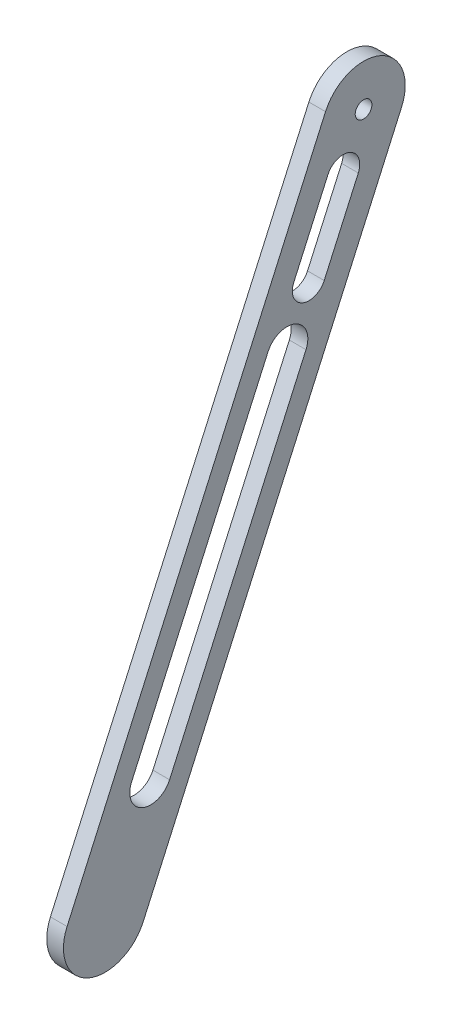
ISO-10303-21;
HEADER;
FILE_DESCRIPTION(('STEP AP214'),'2;1');
FILE_NAME('part.step','',(''),(''),'','','');
FILE_SCHEMA(('AUTOMOTIVE_DESIGN { 1 0 10303 214 1 1 1 1 }'));
ENDSEC;
DATA;
#1=APPLICATION_CONTEXT('core data for automotive mechanical design processes');
#2=APPLICATION_PROTOCOL_DEFINITION('international standard','automotive_design',2000,#1);
#3=PRODUCT_CONTEXT('',#1,'mechanical');
#4=PRODUCT('Part','Part','',(#3));
#5=PRODUCT_RELATED_PRODUCT_CATEGORY('part','',(#4));
#6=PRODUCT_DEFINITION_FORMATION('','',#4);
#7=PRODUCT_DEFINITION_CONTEXT('part definition',#1,'design');
#8=PRODUCT_DEFINITION('design','',#6,#7);
#9=PRODUCT_DEFINITION_SHAPE('','',#8);
#10=(LENGTH_UNIT() NAMED_UNIT(*) SI_UNIT(.MILLI.,.METRE.));
#11=(NAMED_UNIT(*) PLANE_ANGLE_UNIT() SI_UNIT($,.RADIAN.));
#12=(NAMED_UNIT(*) SI_UNIT($,.STERADIAN.) SOLID_ANGLE_UNIT());
#13=UNCERTAINTY_MEASURE_WITH_UNIT(LENGTH_MEASURE(1.E-05),#10,'distance_accuracy_value','');
#14=(GEOMETRIC_REPRESENTATION_CONTEXT(3) GLOBAL_UNCERTAINTY_ASSIGNED_CONTEXT((#13)) GLOBAL_UNIT_ASSIGNED_CONTEXT((#10,
#11,#12)) REPRESENTATION_CONTEXT('',''));
#15=CARTESIAN_POINT('',(0.,0.,0.));
#16=DIRECTION('',(0.,0.,1.));
#17=DIRECTION('',(1.,0.,0.));
#18=AXIS2_PLACEMENT_3D('',#15,#16,#17);
#19=CARTESIAN_POINT('',(3.,15.4,140.123817953225));
#20=DIRECTION('',(1.,0.,0.));
#21=DIRECTION('',(0.,0.,-1.));
#22=AXIS2_PLACEMENT_3D('',#19,#20,#21);
#23=PLANE('',#22);
#24=DIRECTION('',(0.,0.912482298428306,-0.409116187720549));
#25=VECTOR('',#24,1.);
#26=CARTESIAN_POINT('',(3.,86.8643981703128,103.972714316475));
#27=LINE('',#26,#25);
#28=CARTESIAN_POINT('',(3.,32.1154602646141,128.519685579708));
#29=VERTEX_POINT('',#28);
#30=CARTESIAN_POINT('',(3.,86.8643981703128,103.972714316475));
#31=VERTEX_POINT('',#30);
#32=EDGE_CURVE('E166',#29,#31,#27,.T.);
#33=ORIENTED_EDGE('',*,*,#32,.F.);
#34=CARTESIAN_POINT('',(3.,33.6496459685661,131.941494198814));
#35=DIRECTION('',(1.,0.,0.));
#36=DIRECTION('',(0.,0.,-1.));
#37=AXIS2_PLACEMENT_3D('',#34,#35,#36);
#38=CIRCLE('',#37,3.75000000000001);
#39=CARTESIAN_POINT('',(3.,35.1838316725182,135.36330281792));
#40=VERTEX_POINT('',#39);
#41=EDGE_CURVE('E164',#40,#29,#38,.T.);
#42=ORIENTED_EDGE('',*,*,#41,.F.);
#43=DIRECTION('',(0.,-0.912482298428307,0.409116187720549));
#44=VECTOR('',#43,1.);
#45=CARTESIAN_POINT('',(3.,89.9327695782166,110.816331554687));
#46=LINE('',#45,#44);
#47=CARTESIAN_POINT('',(3.,89.9327695782166,110.816331554687));
#48=VERTEX_POINT('',#47);
#49=EDGE_CURVE('E172',#48,#40,#46,.T.);
#50=ORIENTED_EDGE('',*,*,#49,.F.);
#51=CARTESIAN_POINT('',(3.,88.3985838742648,107.394522935581));
#52=DIRECTION('',(1.,0.,0.));
#53=DIRECTION('',(0.,0.,-1.));
#54=AXIS2_PLACEMENT_3D('',#51,#52,#53);
#55=CIRCLE('',#54,3.75000000000001);
#56=EDGE_CURVE('E169',#31,#48,#55,.T.);
#57=ORIENTED_EDGE('',*,*,#56,.F.);
#58=EDGE_LOOP('',(#33,#42,#50,#57));
#59=FACE_BOUND('',#58,.T.);
#60=CARTESIAN_POINT('',(3.,15.4,140.123817953225));
#61=DIRECTION('',(1.,0.,0.));
#62=DIRECTION('',(0.,0.,-1.));
#63=AXIS2_PLACEMENT_3D('',#60,#61,#62);
#64=CIRCLE('',#63,7.50000000000007);
#65=CARTESIAN_POINT('',(3.,18.4683714079041,146.967435191437));
#66=VERTEX_POINT('',#65);
#67=CARTESIAN_POINT('',(3.,12.3316285920959,133.280200715013));
#68=VERTEX_POINT('',#67);
#69=EDGE_CURVE('E195',#66,#68,#64,.T.);
#70=ORIENTED_EDGE('',*,*,#69,.T.);
#71=DIRECTION('',(0.,0.912482298428307,-0.409116187720549));
#72=VECTOR('',#71,1.);
#73=CARTESIAN_POINT('',(3.,116.060383397011,86.7728736184962));
#74=LINE('',#73,#72);
#75=CARTESIAN_POINT('',(3.,116.060383397011,86.7728736184962));
#76=VERTEX_POINT('',#75);
#77=EDGE_CURVE('E198',#68,#76,#74,.T.);
#78=ORIENTED_EDGE('',*,*,#77,.T.);
#79=CARTESIAN_POINT('',(3.,119.128754804915,93.6164908567085));
#80=DIRECTION('',(1.,0.,0.));
#81=DIRECTION('',(0.,0.,-1.));
#82=AXIS2_PLACEMENT_3D('',#79,#80,#81);
#83=CIRCLE('',#82,7.50000000000004);
#84=CARTESIAN_POINT('',(3.,122.197126212819,100.460108094921));
#85=VERTEX_POINT('',#84);
#86=EDGE_CURVE('E201',#76,#85,#83,.T.);
#87=ORIENTED_EDGE('',*,*,#86,.T.);
#88=DIRECTION('',(0.,-0.912482298428306,0.409116187720549));
#89=VECTOR('',#88,1.);
#90=CARTESIAN_POINT('',(3.,122.197126212819,100.460108094921));
#91=LINE('',#90,#89);
#92=EDGE_CURVE('E203',#85,#66,#91,.T.);
#93=ORIENTED_EDGE('',*,*,#92,.T.);
#94=EDGE_LOOP('',(#70,#78,#87,#93));
#95=FACE_BOUND('',#94,.T.);
#96=CARTESIAN_POINT('',(3.,119.128754804915,93.6164908567085));
#97=DIRECTION('',(1.,0.,0.));
#98=DIRECTION('',(0.,0.,-1.));
#99=AXIS2_PLACEMENT_3D('',#96,#97,#98);
#100=CIRCLE('',#99,1.4999999999999);
#101=CARTESIAN_POINT('',(3.,119.128754804915,92.1164908567086));
#102=VERTEX_POINT('',#101);
#103=EDGE_CURVE('E158',#102,#102,#100,.T.);
#104=ORIENTED_EDGE('',*,*,#103,.F.);
#105=EDGE_LOOP('',(#104));
#106=FACE_BOUND('',#105,.T.);
#107=DIRECTION('',(0.,-0.912482298428307,0.409116187720548));
#108=VECTOR('',#107,1.);
#109=CARTESIAN_POINT('',(3.,112.143762682222,100.035983441478));
#110=LINE('',#109,#108);
#111=CARTESIAN_POINT('',(3.,112.143762682222,100.035983441478));
#112=VERTEX_POINT('',#111);
#113=CARTESIAN_POINT('',(3.,98.4565282057972,106.172726257287));
#114=VERTEX_POINT('',#113);
#115=EDGE_CURVE('E130',#112,#114,#110,.T.);
#116=ORIENTED_EDGE('',*,*,#115,.F.);
#117=CARTESIAN_POINT('',(3.,110.91641411906,97.2985365461935));
#118=DIRECTION('',(1.,0.,0.));
#119=DIRECTION('',(0.,0.,-1.));
#120=AXIS2_PLACEMENT_3D('',#117,#118,#119);
#121=CIRCLE('',#120,3.);
#122=CARTESIAN_POINT('',(3.,109.689065555898,94.5610896509086));
#123=VERTEX_POINT('',#122);
#124=EDGE_CURVE('E122',#123,#112,#121,.T.);
#125=ORIENTED_EDGE('',*,*,#124,.F.);
#126=DIRECTION('',(0.,0.912482298428306,-0.40911618772055));
#127=VECTOR('',#126,1.);
#128=CARTESIAN_POINT('',(3.,109.689065555898,94.5610896509086));
#129=LINE('',#128,#127);
#130=CARTESIAN_POINT('',(3.,96.0018310794739,100.697832466717));
#131=VERTEX_POINT('',#130);
#132=EDGE_CURVE('E144',#131,#123,#129,.T.);
#133=ORIENTED_EDGE('',*,*,#132,.F.);
#134=CARTESIAN_POINT('',(3.,97.2291796426356,103.435279362002));
#135=DIRECTION('',(1.,0.,0.));
#136=DIRECTION('',(0.,0.,-1.));
#137=AXIS2_PLACEMENT_3D('',#134,#135,#136);
#138=CIRCLE('',#137,2.99999999999999);
#139=EDGE_CURVE('E142',#114,#131,#138,.T.);
#140=ORIENTED_EDGE('',*,*,#139,.F.);
#141=EDGE_LOOP('',(#116,#125,#133,#140));
#142=FACE_BOUND('',#141,.T.);
#143=ADVANCED_FACE('F33',(#59,#95,#106,#142),#23,.T.);
#144=CARTESIAN_POINT('',(0.,15.4,140.123817953225));
#145=DIRECTION('',(1.,0.,0.));
#146=DIRECTION('',(0.,0.,-1.));
#147=AXIS2_PLACEMENT_3D('',#144,#145,#146);
#148=PLANE('',#147);
#149=CARTESIAN_POINT('',(0.,119.128754804915,93.6164908567085));
#150=DIRECTION('',(1.,0.,0.));
#151=DIRECTION('',(0.,0.,-1.));
#152=AXIS2_PLACEMENT_3D('',#149,#150,#151);
#153=CIRCLE('',#152,1.4999999999999);
#154=CARTESIAN_POINT('',(0.,119.128754804915,92.1164908567086));
#155=VERTEX_POINT('',#154);
#156=EDGE_CURVE('E138',#155,#155,#153,.T.);
#157=ORIENTED_EDGE('',*,*,#156,.T.);
#158=EDGE_LOOP('',(#157));
#159=FACE_BOUND('',#158,.T.);
#160=CARTESIAN_POINT('',(0.,33.6496459685661,131.941494198814));
#161=DIRECTION('',(1.,0.,0.));
#162=DIRECTION('',(0.,0.,-1.));
#163=AXIS2_PLACEMENT_3D('',#160,#161,#162);
#164=CIRCLE('',#163,3.75000000000001);
#165=CARTESIAN_POINT('',(0.,35.1838316725182,135.36330281792));
#166=VERTEX_POINT('',#165);
#167=CARTESIAN_POINT('',(0.,32.1154602646141,128.519685579708));
#168=VERTEX_POINT('',#167);
#169=EDGE_CURVE('E161',#166,#168,#164,.T.);
#170=ORIENTED_EDGE('',*,*,#169,.T.);
#171=DIRECTION('',(0.,0.912482298428306,-0.409116187720549));
#172=VECTOR('',#171,1.);
#173=CARTESIAN_POINT('',(0.,86.8643981703128,103.972714316475));
#174=LINE('',#173,#172);
#175=CARTESIAN_POINT('',(0.,86.8643981703128,103.972714316475));
#176=VERTEX_POINT('',#175);
#177=EDGE_CURVE('E177',#168,#176,#174,.T.);
#178=ORIENTED_EDGE('',*,*,#177,.T.);
#179=CARTESIAN_POINT('',(0.,88.3985838742648,107.394522935581));
#180=DIRECTION('',(1.,0.,0.));
#181=DIRECTION('',(0.,0.,-1.));
#182=AXIS2_PLACEMENT_3D('',#179,#180,#181);
#183=CIRCLE('',#182,3.75000000000001);
#184=CARTESIAN_POINT('',(0.,89.9327695782166,110.816331554687));
#185=VERTEX_POINT('',#184);
#186=EDGE_CURVE('E180',#176,#185,#183,.T.);
#187=ORIENTED_EDGE('',*,*,#186,.T.);
#188=DIRECTION('',(0.,-0.912482298428307,0.409116187720549));
#189=VECTOR('',#188,1.);
#190=CARTESIAN_POINT('',(0.,89.9327695782166,110.816331554687));
#191=LINE('',#190,#189);
#192=EDGE_CURVE('E167',#185,#166,#191,.T.);
#193=ORIENTED_EDGE('',*,*,#192,.T.);
#194=EDGE_LOOP('',(#170,#178,#187,#193));
#195=FACE_BOUND('',#194,.T.);
#196=CARTESIAN_POINT('',(0.,15.4,140.123817953225));
#197=DIRECTION('',(1.,0.,0.));
#198=DIRECTION('',(0.,0.,-1.));
#199=AXIS2_PLACEMENT_3D('',#196,#197,#198);
#200=CIRCLE('',#199,7.50000000000007);
#201=CARTESIAN_POINT('',(0.,18.4683714079041,146.967435191437));
#202=VERTEX_POINT('',#201);
#203=CARTESIAN_POINT('',(0.,12.3316285920959,133.280200715013));
#204=VERTEX_POINT('',#203);
#205=EDGE_CURVE('E194',#202,#204,#200,.T.);
#206=ORIENTED_EDGE('',*,*,#205,.F.);
#207=DIRECTION('',(0.,-0.912482298428306,0.409116187720549));
#208=VECTOR('',#207,1.);
#209=CARTESIAN_POINT('',(0.,122.197126212819,100.460108094921));
#210=LINE('',#209,#208);
#211=CARTESIAN_POINT('',(0.,122.197126212819,100.460108094921));
#212=VERTEX_POINT('',#211);
#213=EDGE_CURVE('E199',#212,#202,#210,.T.);
#214=ORIENTED_EDGE('',*,*,#213,.F.);
#215=CARTESIAN_POINT('',(0.,119.128754804915,93.6164908567085));
#216=DIRECTION('',(1.,0.,0.));
#217=DIRECTION('',(0.,0.,-1.));
#218=AXIS2_PLACEMENT_3D('',#215,#216,#217);
#219=CIRCLE('',#218,7.50000000000004);
#220=CARTESIAN_POINT('',(0.,116.060383397011,86.7728736184962));
#221=VERTEX_POINT('',#220);
#222=EDGE_CURVE('E210',#221,#212,#219,.T.);
#223=ORIENTED_EDGE('',*,*,#222,.F.);
#224=DIRECTION('',(0.,0.912482298428307,-0.409116187720549));
#225=VECTOR('',#224,1.);
#226=CARTESIAN_POINT('',(0.,116.060383397011,86.7728736184962));
#227=LINE('',#226,#225);
#228=EDGE_CURVE('E208',#204,#221,#227,.T.);
#229=ORIENTED_EDGE('',*,*,#228,.F.);
#230=EDGE_LOOP('',(#206,#214,#223,#229));
#231=FACE_BOUND('',#230,.T.);
#232=CARTESIAN_POINT('',(0.,110.91641411906,97.2985365461935));
#233=DIRECTION('',(1.,0.,0.));
#234=DIRECTION('',(0.,0.,-1.));
#235=AXIS2_PLACEMENT_3D('',#232,#233,#234);
#236=CIRCLE('',#235,3.);
#237=CARTESIAN_POINT('',(0.,109.689065555898,94.5610896509086));
#238=VERTEX_POINT('',#237);
#239=CARTESIAN_POINT('',(0.,112.143762682222,100.035983441478));
#240=VERTEX_POINT('',#239);
#241=EDGE_CURVE('E56',#238,#240,#236,.T.);
#242=ORIENTED_EDGE('',*,*,#241,.T.);
#243=DIRECTION('',(0.,-0.912482298428307,0.409116187720548));
#244=VECTOR('',#243,1.);
#245=CARTESIAN_POINT('',(0.,112.143762682222,100.035983441478));
#246=LINE('',#245,#244);
#247=CARTESIAN_POINT('',(0.,98.4565282057972,106.172726257287));
#248=VERTEX_POINT('',#247);
#249=EDGE_CURVE('E137',#240,#248,#246,.T.);
#250=ORIENTED_EDGE('',*,*,#249,.T.);
#251=CARTESIAN_POINT('',(0.,97.2291796426356,103.435279362002));
#252=DIRECTION('',(1.,0.,0.));
#253=DIRECTION('',(0.,0.,-1.));
#254=AXIS2_PLACEMENT_3D('',#251,#252,#253);
#255=CIRCLE('',#254,2.99999999999999);
#256=CARTESIAN_POINT('',(0.,96.0018310794739,100.697832466717));
#257=VERTEX_POINT('',#256);
#258=EDGE_CURVE('E150',#248,#257,#255,.T.);
#259=ORIENTED_EDGE('',*,*,#258,.T.);
#260=DIRECTION('',(0.,0.912482298428306,-0.40911618772055));
#261=VECTOR('',#260,1.);
#262=CARTESIAN_POINT('',(0.,109.689065555898,94.5610896509086));
#263=LINE('',#262,#261);
#264=EDGE_CURVE('E131',#257,#238,#263,.T.);
#265=ORIENTED_EDGE('',*,*,#264,.T.);
#266=EDGE_LOOP('',(#242,#250,#259,#265));
#267=FACE_BOUND('',#266,.T.);
#268=ADVANCED_FACE('F228',(#159,#195,#231,#267),#148,.F.);
#269=CARTESIAN_POINT('',(3.,15.4,140.123817953225));
#270=DIRECTION('',(-1.,0.,0.));
#271=DIRECTION('',(0.,0.,1.));
#272=AXIS2_PLACEMENT_3D('',#269,#270,#271);
#273=CYLINDRICAL_SURFACE('',#272,7.50000000000007);
#274=ORIENTED_EDGE('',*,*,#205,.T.);
#275=DIRECTION('',(-1.,0.,0.));
#276=VECTOR('',#275,1.);
#277=CARTESIAN_POINT('',(3.,12.3316285920959,133.280200715013));
#278=LINE('',#277,#276);
#279=EDGE_CURVE('E11',#68,#204,#278,.T.);
#280=ORIENTED_EDGE('',*,*,#279,.F.);
#281=ORIENTED_EDGE('',*,*,#69,.F.);
#282=DIRECTION('',(-1.,0.,0.));
#283=VECTOR('',#282,1.);
#284=CARTESIAN_POINT('',(3.,18.4683714079041,146.967435191437));
#285=LINE('',#284,#283);
#286=EDGE_CURVE('E205',#66,#202,#285,.T.);
#287=ORIENTED_EDGE('',*,*,#286,.T.);
#288=EDGE_LOOP('',(#274,#280,#281,#287));
#289=FACE_BOUND('',#288,.T.);
#290=ADVANCED_FACE('F35',(#289),#273,.T.);
#291=CARTESIAN_POINT('',(3.,116.060383397011,86.7728736184962));
#292=DIRECTION('',(0.,0.409116187720548,0.912482298428306));
#293=DIRECTION('',(0.,-0.912482298428307,0.409116187720549));
#294=AXIS2_PLACEMENT_3D('',#291,#292,#293);
#295=PLANE('',#294);
#296=ORIENTED_EDGE('',*,*,#228,.T.);
#297=DIRECTION('',(-1.,0.,0.));
#298=VECTOR('',#297,1.);
#299=CARTESIAN_POINT('',(3.,116.060383397011,86.7728736184962));
#300=LINE('',#299,#298);
#301=EDGE_CURVE('E41',#76,#221,#300,.T.);
#302=ORIENTED_EDGE('',*,*,#301,.F.);
#303=ORIENTED_EDGE('',*,*,#77,.F.);
#304=ORIENTED_EDGE('',*,*,#279,.T.);
#305=EDGE_LOOP('',(#296,#302,#303,#304));
#306=FACE_BOUND('',#305,.T.);
#307=ADVANCED_FACE('F239',(#306),#295,.F.);
#308=CARTESIAN_POINT('',(3.,119.128754804915,93.6164908567085));
#309=DIRECTION('',(-1.,0.,0.));
#310=DIRECTION('',(0.,0.,1.));
#311=AXIS2_PLACEMENT_3D('',#308,#309,#310);
#312=CYLINDRICAL_SURFACE('',#311,7.50000000000004);
#313=ORIENTED_EDGE('',*,*,#222,.T.);
#314=DIRECTION('',(-1.,0.,0.));
#315=VECTOR('',#314,1.);
#316=CARTESIAN_POINT('',(3.,122.197126212819,100.460108094921));
#317=LINE('',#316,#315);
#318=EDGE_CURVE('E215',#85,#212,#317,.T.);
#319=ORIENTED_EDGE('',*,*,#318,.F.);
#320=ORIENTED_EDGE('',*,*,#86,.F.);
#321=ORIENTED_EDGE('',*,*,#301,.T.);
#322=EDGE_LOOP('',(#313,#319,#320,#321));
#323=FACE_BOUND('',#322,.T.);
#324=ADVANCED_FACE('F222',(#323),#312,.T.);
#325=CARTESIAN_POINT('',(3.,122.197126212819,100.460108094921));
#326=DIRECTION('',(0.,-0.409116187720549,-0.912482298428306));
#327=DIRECTION('',(0.,0.912482298428306,-0.409116187720549));
#328=AXIS2_PLACEMENT_3D('',#325,#326,#327);
#329=PLANE('',#328);
#330=ORIENTED_EDGE('',*,*,#213,.T.);
#331=ORIENTED_EDGE('',*,*,#286,.F.);
#332=ORIENTED_EDGE('',*,*,#92,.F.);
#333=ORIENTED_EDGE('',*,*,#318,.T.);
#334=EDGE_LOOP('',(#330,#331,#332,#333));
#335=FACE_BOUND('',#334,.T.);
#336=ADVANCED_FACE('F232',(#335),#329,.F.);
#337=CARTESIAN_POINT('',(3.,33.6496459685661,131.941494198814));
#338=DIRECTION('',(-1.,0.,0.));
#339=DIRECTION('',(0.,0.,1.));
#340=AXIS2_PLACEMENT_3D('',#337,#338,#339);
#341=CYLINDRICAL_SURFACE('',#340,3.75000000000001);
#342=ORIENTED_EDGE('',*,*,#169,.F.);
#343=DIRECTION('',(-1.,0.,0.));
#344=VECTOR('',#343,1.);
#345=CARTESIAN_POINT('',(3.,35.1838316725182,135.36330281792));
#346=LINE('',#345,#344);
#347=EDGE_CURVE('E174',#40,#166,#346,.T.);
#348=ORIENTED_EDGE('',*,*,#347,.F.);
#349=ORIENTED_EDGE('',*,*,#41,.T.);
#350=DIRECTION('',(-1.,0.,0.));
#351=VECTOR('',#350,1.);
#352=CARTESIAN_POINT('',(3.,32.1154602646141,128.519685579708));
#353=LINE('',#352,#351);
#354=EDGE_CURVE('E191',#29,#168,#353,.T.);
#355=ORIENTED_EDGE('',*,*,#354,.T.);
#356=EDGE_LOOP('',(#342,#348,#349,#355));
#357=FACE_BOUND('',#356,.T.);
#358=ADVANCED_FACE('F256',(#357),#341,.F.);
#359=CARTESIAN_POINT('',(3.,86.8643981703128,103.972714316475));
#360=DIRECTION('',(0.,0.409116187720549,0.912482298428306));
#361=DIRECTION('',(0.,-0.912482298428306,0.409116187720549));
#362=AXIS2_PLACEMENT_3D('',#359,#360,#361);
#363=PLANE('',#362);
#364=ORIENTED_EDGE('',*,*,#177,.F.);
#365=ORIENTED_EDGE('',*,*,#354,.F.);
#366=ORIENTED_EDGE('',*,*,#32,.T.);
#367=DIRECTION('',(-1.,0.,0.));
#368=VECTOR('',#367,1.);
#369=CARTESIAN_POINT('',(3.,86.8643981703128,103.972714316475));
#370=LINE('',#369,#368);
#371=EDGE_CURVE('E189',#31,#176,#370,.T.);
#372=ORIENTED_EDGE('',*,*,#371,.T.);
#373=EDGE_LOOP('',(#364,#365,#366,#372));
#374=FACE_BOUND('',#373,.T.);
#375=ADVANCED_FACE('F263',(#374),#363,.T.);
#376=CARTESIAN_POINT('',(3.,88.3985838742648,107.394522935581));
#377=DIRECTION('',(-1.,0.,0.));
#378=DIRECTION('',(0.,0.,1.));
#379=AXIS2_PLACEMENT_3D('',#376,#377,#378);
#380=CYLINDRICAL_SURFACE('',#379,3.75000000000001);
#381=ORIENTED_EDGE('',*,*,#186,.F.);
#382=ORIENTED_EDGE('',*,*,#371,.F.);
#383=ORIENTED_EDGE('',*,*,#56,.T.);
#384=DIRECTION('',(-1.,0.,0.));
#385=VECTOR('',#384,1.);
#386=CARTESIAN_POINT('',(3.,89.9327695782166,110.816331554687));
#387=LINE('',#386,#385);
#388=EDGE_CURVE('E187',#48,#185,#387,.T.);
#389=ORIENTED_EDGE('',*,*,#388,.T.);
#390=EDGE_LOOP('',(#381,#382,#383,#389));
#391=FACE_BOUND('',#390,.T.);
#392=ADVANCED_FACE('F268',(#391),#380,.F.);
#393=CARTESIAN_POINT('',(3.,89.9327695782166,110.816331554687));
#394=DIRECTION('',(0.,-0.409116187720549,-0.912482298428306));
#395=DIRECTION('',(0.,0.912482298428307,-0.409116187720549));
#396=AXIS2_PLACEMENT_3D('',#393,#394,#395);
#397=PLANE('',#396);
#398=ORIENTED_EDGE('',*,*,#192,.F.);
#399=ORIENTED_EDGE('',*,*,#388,.F.);
#400=ORIENTED_EDGE('',*,*,#49,.T.);
#401=ORIENTED_EDGE('',*,*,#347,.T.);
#402=EDGE_LOOP('',(#398,#399,#400,#401));
#403=FACE_BOUND('',#402,.T.);
#404=ADVANCED_FACE('F276',(#403),#397,.T.);
#405=CARTESIAN_POINT('',(3.,119.128754804915,93.6164908567085));
#406=DIRECTION('',(-1.,0.,0.));
#407=DIRECTION('',(0.,0.,1.));
#408=AXIS2_PLACEMENT_3D('',#405,#406,#407);
#409=CYLINDRICAL_SURFACE('',#408,1.4999999999999);
#410=ORIENTED_EDGE('',*,*,#103,.T.);
#411=EDGE_LOOP('',(#410));
#412=FACE_BOUND('',#411,.T.);
#413=ORIENTED_EDGE('',*,*,#156,.F.);
#414=EDGE_LOOP('',(#413));
#415=FACE_BOUND('',#414,.T.);
#416=ADVANCED_FACE('F287',(#412,#415),#409,.F.);
#417=CARTESIAN_POINT('',(3.,110.91641411906,97.2985365461935));
#418=DIRECTION('',(-1.,0.,0.));
#419=DIRECTION('',(0.,0.,1.));
#420=AXIS2_PLACEMENT_3D('',#417,#418,#419);
#421=CYLINDRICAL_SURFACE('',#420,3.);
#422=ORIENTED_EDGE('',*,*,#241,.F.);
#423=DIRECTION('',(-1.,0.,0.));
#424=VECTOR('',#423,1.);
#425=CARTESIAN_POINT('',(3.,109.689065555898,94.5610896509086));
#426=LINE('',#425,#424);
#427=EDGE_CURVE('E126',#123,#238,#426,.T.);
#428=ORIENTED_EDGE('',*,*,#427,.F.);
#429=ORIENTED_EDGE('',*,*,#124,.T.);
#430=DIRECTION('',(-1.,0.,0.));
#431=VECTOR('',#430,1.);
#432=CARTESIAN_POINT('',(3.,112.143762682222,100.035983441478));
#433=LINE('',#432,#431);
#434=EDGE_CURVE('E125',#112,#240,#433,.T.);
#435=ORIENTED_EDGE('',*,*,#434,.T.);
#436=EDGE_LOOP('',(#422,#428,#429,#435));
#437=FACE_BOUND('',#436,.T.);
#438=ADVANCED_FACE('F124',(#437),#421,.F.);
#439=CARTESIAN_POINT('',(3.,112.143762682222,100.035983441478));
#440=DIRECTION('',(0.,-0.409116187720548,-0.912482298428306));
#441=DIRECTION('',(0.,0.912482298428307,-0.409116187720548));
#442=AXIS2_PLACEMENT_3D('',#439,#440,#441);
#443=PLANE('',#442);
#444=ORIENTED_EDGE('',*,*,#249,.F.);
#445=ORIENTED_EDGE('',*,*,#434,.F.);
#446=ORIENTED_EDGE('',*,*,#115,.T.);
#447=DIRECTION('',(-1.,0.,0.));
#448=VECTOR('',#447,1.);
#449=CARTESIAN_POINT('',(3.,98.4565282057972,106.172726257287));
#450=LINE('',#449,#448);
#451=EDGE_CURVE('E139',#114,#248,#450,.T.);
#452=ORIENTED_EDGE('',*,*,#451,.T.);
#453=EDGE_LOOP('',(#444,#445,#446,#452));
#454=FACE_BOUND('',#453,.T.);
#455=ADVANCED_FACE('F134',(#454),#443,.T.);
#456=CARTESIAN_POINT('',(3.,97.2291796426356,103.435279362002));
#457=DIRECTION('',(-1.,0.,0.));
#458=DIRECTION('',(0.,0.,1.));
#459=AXIS2_PLACEMENT_3D('',#456,#457,#458);
#460=CYLINDRICAL_SURFACE('',#459,2.99999999999999);
#461=ORIENTED_EDGE('',*,*,#258,.F.);
#462=ORIENTED_EDGE('',*,*,#451,.F.);
#463=ORIENTED_EDGE('',*,*,#139,.T.);
#464=DIRECTION('',(-1.,0.,0.));
#465=VECTOR('',#464,1.);
#466=CARTESIAN_POINT('',(3.,96.0018310794739,100.697832466717));
#467=LINE('',#466,#465);
#468=EDGE_CURVE('E48',#131,#257,#467,.T.);
#469=ORIENTED_EDGE('',*,*,#468,.T.);
#470=EDGE_LOOP('',(#461,#462,#463,#469));
#471=FACE_BOUND('',#470,.T.);
#472=ADVANCED_FACE('F297',(#471),#460,.F.);
#473=CARTESIAN_POINT('',(3.,109.689065555898,94.5610896509086));
#474=DIRECTION('',(0.,0.40911618772055,0.912482298428306));
#475=DIRECTION('',(0.,-0.912482298428306,0.40911618772055));
#476=AXIS2_PLACEMENT_3D('',#473,#474,#475);
#477=PLANE('',#476);
#478=ORIENTED_EDGE('',*,*,#264,.F.);
#479=ORIENTED_EDGE('',*,*,#468,.F.);
#480=ORIENTED_EDGE('',*,*,#132,.T.);
#481=ORIENTED_EDGE('',*,*,#427,.T.);
#482=EDGE_LOOP('',(#478,#479,#480,#481));
#483=FACE_BOUND('',#482,.T.);
#484=ADVANCED_FACE('F300',(#483),#477,.T.);
#485=CLOSED_SHELL('',(#143,#268,#290,#307,#324,#336,#358,#375,#392,#404,#416,#438,#455,#472,#484));
#486=MANIFOLD_SOLID_BREP('B2',#485);
#487=ADVANCED_BREP_SHAPE_REPRESENTATION('',(#18,#486),#14);
#488=SHAPE_DEFINITION_REPRESENTATION(#9,#487);
ENDSEC;
END-ISO-10303-21;
